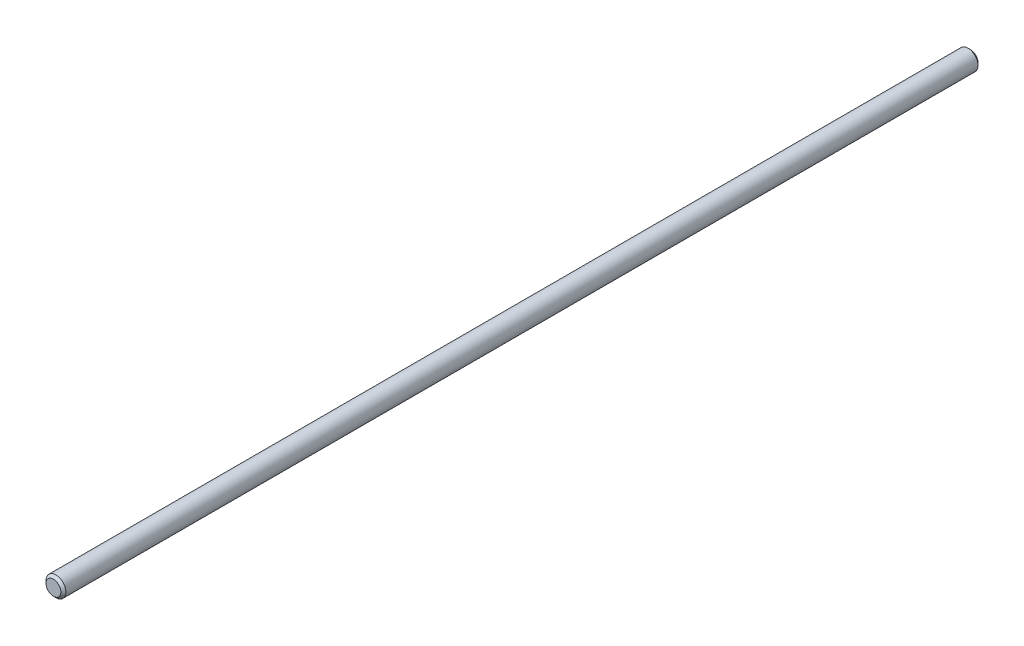
ISO-10303-21;
HEADER;
FILE_DESCRIPTION(('STEP AP214'),'2;1');
FILE_NAME('part.step','',(''),(''),'','','');
FILE_SCHEMA(('AUTOMOTIVE_DESIGN { 1 0 10303 214 1 1 1 1 }'));
ENDSEC;
DATA;
#1=APPLICATION_CONTEXT('core data for automotive mechanical design processes');
#2=APPLICATION_PROTOCOL_DEFINITION('international standard','automotive_design',2000,#1);
#3=PRODUCT_CONTEXT('',#1,'mechanical');
#4=PRODUCT('Part','Part','',(#3));
#5=PRODUCT_RELATED_PRODUCT_CATEGORY('part','',(#4));
#6=PRODUCT_DEFINITION_FORMATION('','',#4);
#7=PRODUCT_DEFINITION_CONTEXT('part definition',#1,'design');
#8=PRODUCT_DEFINITION('design','',#6,#7);
#9=PRODUCT_DEFINITION_SHAPE('','',#8);
#10=(LENGTH_UNIT() NAMED_UNIT(*) SI_UNIT(.MILLI.,.METRE.));
#11=(NAMED_UNIT(*) PLANE_ANGLE_UNIT() SI_UNIT($,.RADIAN.));
#12=(NAMED_UNIT(*) SI_UNIT($,.STERADIAN.) SOLID_ANGLE_UNIT());
#13=UNCERTAINTY_MEASURE_WITH_UNIT(LENGTH_MEASURE(1.E-05),#10,'distance_accuracy_value','');
#14=(GEOMETRIC_REPRESENTATION_CONTEXT(3) GLOBAL_UNCERTAINTY_ASSIGNED_CONTEXT((#13)) GLOBAL_UNIT_ASSIGNED_CONTEXT((#10,
#11,#12)) REPRESENTATION_CONTEXT('',''));
#15=CARTESIAN_POINT('',(0.,0.,0.));
#16=DIRECTION('',(0.,0.,1.));
#17=DIRECTION('',(1.,0.,0.));
#18=AXIS2_PLACEMENT_3D('',#15,#16,#17);
#19=CARTESIAN_POINT('',(0.,0.,370.));
#20=DIRECTION('',(0.,0.,-1.));
#21=DIRECTION('',(-1.,0.,0.));
#22=AXIS2_PLACEMENT_3D('',#19,#20,#21);
#23=CYLINDRICAL_SURFACE('',#22,4.);
#24=CARTESIAN_POINT('',(0.,0.,369.));
#25=DIRECTION('',(0.,0.,1.));
#26=DIRECTION('',(1.,0.,0.));
#27=AXIS2_PLACEMENT_3D('',#24,#25,#26);
#28=CIRCLE('',#27,4.);
#29=CARTESIAN_POINT('',(4.,0.,369.));
#30=VERTEX_POINT('',#29);
#31=EDGE_CURVE('E37',#30,#30,#28,.F.);
#32=ORIENTED_EDGE('',*,*,#31,.T.);
#33=EDGE_LOOP('',(#32));
#34=FACE_BOUND('',#33,.T.);
#35=CARTESIAN_POINT('',(0.,0.,1.00000000000006));
#36=DIRECTION('',(0.,0.,1.));
#37=DIRECTION('',(1.,0.,0.));
#38=AXIS2_PLACEMENT_3D('',#35,#36,#37);
#39=CIRCLE('',#38,4.);
#40=CARTESIAN_POINT('',(4.,0.,1.00000000000006));
#41=VERTEX_POINT('',#40);
#42=EDGE_CURVE('E41',#41,#41,#39,.T.);
#43=ORIENTED_EDGE('',*,*,#42,.T.);
#44=EDGE_LOOP('',(#43));
#45=FACE_BOUND('',#44,.T.);
#46=ADVANCED_FACE('F30',(#34,#45),#23,.T.);
#47=CARTESIAN_POINT('',(0.,0.,370.));
#48=DIRECTION('',(0.,0.,1.));
#49=DIRECTION('',(1.,0.,0.));
#50=AXIS2_PLACEMENT_3D('',#47,#48,#49);
#51=PLANE('',#50);
#52=CARTESIAN_POINT('',(0.,0.,370.));
#53=DIRECTION('',(0.,0.,1.));
#54=DIRECTION('',(1.,0.,0.));
#55=AXIS2_PLACEMENT_3D('',#52,#53,#54);
#56=CIRCLE('',#55,3.);
#57=CARTESIAN_POINT('',(3.,0.,370.));
#58=VERTEX_POINT('',#57);
#59=EDGE_CURVE('E45',#58,#58,#56,.T.);
#60=ORIENTED_EDGE('',*,*,#59,.T.);
#61=EDGE_LOOP('',(#60));
#62=FACE_BOUND('',#61,.T.);
#63=ADVANCED_FACE('F51',(#62),#51,.T.);
#64=CARTESIAN_POINT('',(0.,0.,0.));
#65=DIRECTION('',(0.,0.,1.));
#66=DIRECTION('',(1.,0.,0.));
#67=AXIS2_PLACEMENT_3D('',#64,#65,#66);
#68=PLANE('',#67);
#69=CARTESIAN_POINT('',(0.,0.,0.));
#70=DIRECTION('',(0.,0.,1.));
#71=DIRECTION('',(1.,0.,0.));
#72=AXIS2_PLACEMENT_3D('',#69,#70,#71);
#73=CIRCLE('',#72,2.99999999999995);
#74=CARTESIAN_POINT('',(2.99999999999995,0.,0.));
#75=VERTEX_POINT('',#74);
#76=EDGE_CURVE('E10',#75,#75,#73,.F.);
#77=ORIENTED_EDGE('',*,*,#76,.T.);
#78=EDGE_LOOP('',(#77));
#79=FACE_BOUND('',#78,.T.);
#80=ADVANCED_FACE('F55',(#79),#68,.F.);
#81=CARTESIAN_POINT('',(0.,0.,370.));
#82=DIRECTION('',(0.,0.,-1.));
#83=DIRECTION('',(-1.,0.,0.));
#84=AXIS2_PLACEMENT_3D('',#81,#82,#83);
#85=CONICAL_SURFACE('',#84,3.,0.785398163397447);
#86=ORIENTED_EDGE('',*,*,#31,.F.);
#87=EDGE_LOOP('',(#86));
#88=FACE_BOUND('',#87,.T.);
#89=ORIENTED_EDGE('',*,*,#59,.F.);
#90=EDGE_LOOP('',(#89));
#91=FACE_BOUND('',#90,.T.);
#92=ADVANCED_FACE('F53',(#88,#91),#85,.T.);
#93=CARTESIAN_POINT('',(0.,0.,1.00000000000006));
#94=DIRECTION('',(0.,0.,1.));
#95=DIRECTION('',(1.,0.,0.));
#96=AXIS2_PLACEMENT_3D('',#93,#94,#95);
#97=CONICAL_SURFACE('',#96,4.,0.785398163397447);
#98=ORIENTED_EDGE('',*,*,#76,.F.);
#99=EDGE_LOOP('',(#98));
#100=FACE_BOUND('',#99,.T.);
#101=ORIENTED_EDGE('',*,*,#42,.F.);
#102=EDGE_LOOP('',(#101));
#103=FACE_BOUND('',#102,.T.);
#104=ADVANCED_FACE('F32',(#100,#103),#97,.T.);
#105=CLOSED_SHELL('',(#46,#63,#80,#92,#104));
#106=MANIFOLD_SOLID_BREP('B2',#105);
#107=ADVANCED_BREP_SHAPE_REPRESENTATION('',(#18,#106),#14);
#108=SHAPE_DEFINITION_REPRESENTATION(#9,#107);
ENDSEC;
END-ISO-10303-21;
